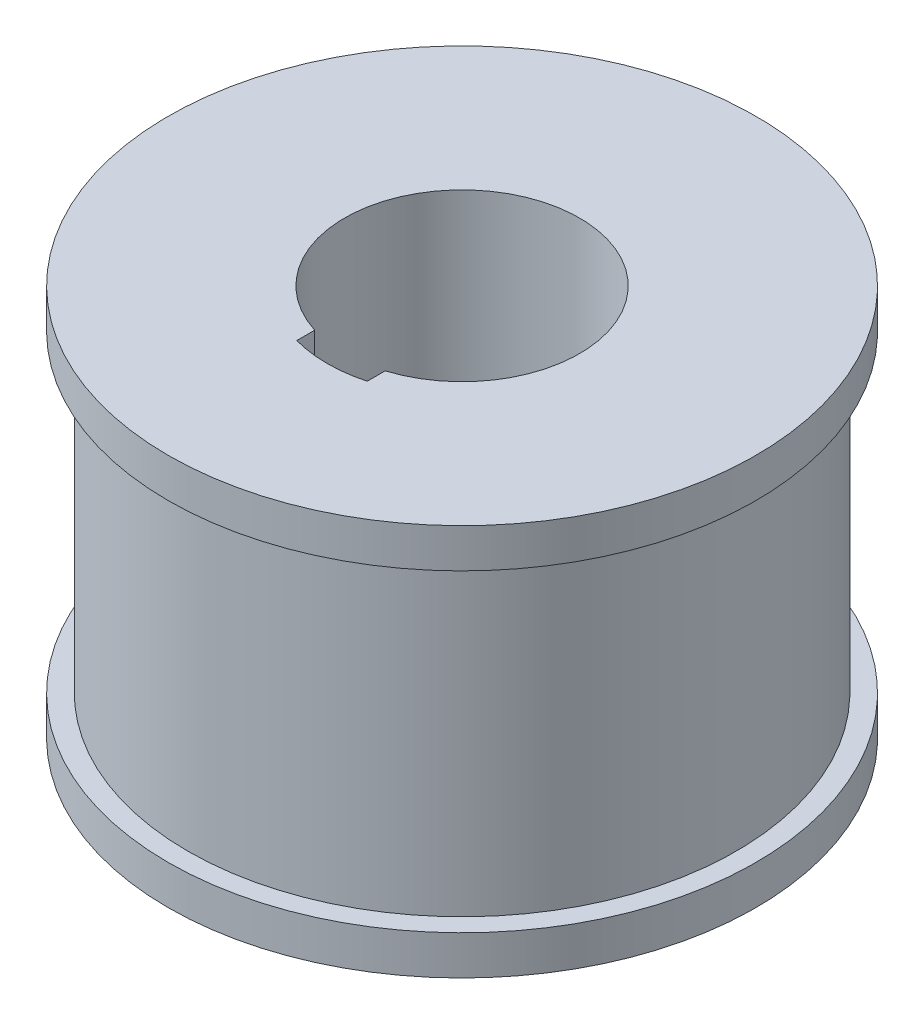
ISO-10303-21;
HEADER;
FILE_DESCRIPTION(('STEP AP214'),'2;1');
FILE_NAME('part.step','',(''),(''),'','','');
FILE_SCHEMA(('AUTOMOTIVE_DESIGN { 1 0 10303 214 1 1 1 1 }'));
ENDSEC;
DATA;
#1=APPLICATION_CONTEXT('core data for automotive mechanical design processes');
#2=APPLICATION_PROTOCOL_DEFINITION('international standard','automotive_design',2000,#1);
#3=PRODUCT_CONTEXT('',#1,'mechanical');
#4=PRODUCT('Part','Part','',(#3));
#5=PRODUCT_RELATED_PRODUCT_CATEGORY('part','',(#4));
#6=PRODUCT_DEFINITION_FORMATION('','',#4);
#7=PRODUCT_DEFINITION_CONTEXT('part definition',#1,'design');
#8=PRODUCT_DEFINITION('design','',#6,#7);
#9=PRODUCT_DEFINITION_SHAPE('','',#8);
#10=(LENGTH_UNIT() NAMED_UNIT(*) SI_UNIT(.MILLI.,.METRE.));
#11=(NAMED_UNIT(*) PLANE_ANGLE_UNIT() SI_UNIT($,.RADIAN.));
#12=(NAMED_UNIT(*) SI_UNIT($,.STERADIAN.) SOLID_ANGLE_UNIT());
#13=UNCERTAINTY_MEASURE_WITH_UNIT(LENGTH_MEASURE(1.E-05),#10,'distance_accuracy_value','');
#14=(GEOMETRIC_REPRESENTATION_CONTEXT(3) GLOBAL_UNCERTAINTY_ASSIGNED_CONTEXT((#13)) GLOBAL_UNIT_ASSIGNED_CONTEXT((#10,
#11,#12)) REPRESENTATION_CONTEXT('',''));
#15=CARTESIAN_POINT('',(0.,0.,0.));
#16=DIRECTION('',(0.,0.,1.));
#17=DIRECTION('',(1.,0.,0.));
#18=AXIS2_PLACEMENT_3D('',#15,#16,#17);
#19=CARTESIAN_POINT('',(0.,40.,0.));
#20=DIRECTION('',(0.,-1.,0.));
#21=DIRECTION('',(0.,0.,-1.));
#22=AXIS2_PLACEMENT_3D('',#19,#20,#21);
#23=CYLINDRICAL_SURFACE('',#22,70.);
#24=CARTESIAN_POINT('',(0.,40.,0.));
#25=DIRECTION('',(0.,1.,0.));
#26=DIRECTION('',(0.,0.,1.));
#27=AXIS2_PLACEMENT_3D('',#24,#25,#26);
#28=CIRCLE('',#27,70.);
#29=CARTESIAN_POINT('',(0.,40.,70.));
#30=VERTEX_POINT('',#29);
#31=EDGE_CURVE('E50',#30,#30,#28,.T.);
#32=ORIENTED_EDGE('',*,*,#31,.F.);
#33=EDGE_LOOP('',(#32));
#34=FACE_BOUND('',#33,.T.);
#35=CARTESIAN_POINT('',(0.,-40.,0.));
#36=DIRECTION('',(0.,1.,0.));
#37=DIRECTION('',(0.,0.,1.));
#38=AXIS2_PLACEMENT_3D('',#35,#36,#37);
#39=CIRCLE('',#38,70.);
#40=CARTESIAN_POINT('',(0.,-40.,70.));
#41=VERTEX_POINT('',#40);
#42=EDGE_CURVE('E118',#41,#41,#39,.T.);
#43=ORIENTED_EDGE('',*,*,#42,.T.);
#44=EDGE_LOOP('',(#43));
#45=FACE_BOUND('',#44,.T.);
#46=ADVANCED_FACE('F43',(#34,#45),#23,.T.);
#47=CARTESIAN_POINT('',(0.,40.,0.));
#48=DIRECTION('',(0.,-1.,0.));
#49=DIRECTION('',(0.,0.,-1.));
#50=AXIS2_PLACEMENT_3D('',#47,#48,#49);
#51=CYLINDRICAL_SURFACE('',#50,30.);
#52=DIRECTION('',(0.,-1.,0.));
#53=VECTOR('',#52,1.);
#54=CARTESIAN_POINT('',(8.99999999999999,40.,28.6181760425084));
#55=LINE('',#54,#53);
#56=CARTESIAN_POINT('',(9.,50.,28.6181760425084));
#57=VERTEX_POINT('',#56);
#58=CARTESIAN_POINT('',(9.,-50.,28.6181760425084));
#59=VERTEX_POINT('',#58);
#60=EDGE_CURVE('E109',#57,#59,#55,.T.);
#61=ORIENTED_EDGE('',*,*,#60,.F.);
#62=CARTESIAN_POINT('',(0.,50.,0.));
#63=DIRECTION('',(0.,1.,0.));
#64=DIRECTION('',(0.,0.,1.));
#65=AXIS2_PLACEMENT_3D('',#62,#63,#64);
#66=CIRCLE('',#65,30.);
#67=CARTESIAN_POINT('',(-9.,50.,28.6181760425084));
#68=VERTEX_POINT('',#67);
#69=EDGE_CURVE('E121',#57,#68,#66,.T.);
#70=ORIENTED_EDGE('',*,*,#69,.T.);
#71=DIRECTION('',(0.,-1.,0.));
#72=VECTOR('',#71,1.);
#73=CARTESIAN_POINT('',(-8.99999999999999,40.,28.6181760425084));
#74=LINE('',#73,#72);
#75=CARTESIAN_POINT('',(-9.,-50.,28.6181760425084));
#76=VERTEX_POINT('',#75);
#77=EDGE_CURVE('E94',#76,#68,#74,.F.);
#78=ORIENTED_EDGE('',*,*,#77,.F.);
#79=CARTESIAN_POINT('',(0.,-50.,0.));
#80=DIRECTION('',(0.,1.,0.));
#81=DIRECTION('',(0.,0.,1.));
#82=AXIS2_PLACEMENT_3D('',#79,#80,#81);
#83=CIRCLE('',#82,30.);
#84=EDGE_CURVE('E111',#59,#76,#83,.T.);
#85=ORIENTED_EDGE('',*,*,#84,.F.);
#86=EDGE_LOOP('',(#61,#70,#78,#85));
#87=FACE_BOUND('',#86,.T.);
#88=ADVANCED_FACE('F157',(#87),#51,.F.);
#89=CARTESIAN_POINT('',(0.,50.,0.));
#90=DIRECTION('',(0.,1.,0.));
#91=DIRECTION('',(0.,0.,1.));
#92=AXIS2_PLACEMENT_3D('',#89,#90,#91);
#93=PLANE('',#92);
#94=DIRECTION('',(0.,0.,1.));
#95=VECTOR('',#94,1.);
#96=CARTESIAN_POINT('',(9.,50.,33.2018071797304));
#97=LINE('',#96,#95);
#98=CARTESIAN_POINT('',(9.,50.,33.2018071797304));
#99=VERTEX_POINT('',#98);
#100=EDGE_CURVE('E65',#57,#99,#97,.T.);
#101=ORIENTED_EDGE('',*,*,#100,.T.);
#102=CARTESIAN_POINT('',(0.,50.,0.));
#103=DIRECTION('',(0.,-1.,0.));
#104=DIRECTION('',(0.,0.,-1.));
#105=AXIS2_PLACEMENT_3D('',#102,#103,#104);
#106=CIRCLE('',#105,34.4);
#107=CARTESIAN_POINT('',(-9.,50.,33.2018071797304));
#108=VERTEX_POINT('',#107);
#109=EDGE_CURVE('E85',#99,#108,#106,.T.);
#110=ORIENTED_EDGE('',*,*,#109,.T.);
#111=DIRECTION('',(0.,0.,-1.));
#112=VECTOR('',#111,1.);
#113=CARTESIAN_POINT('',(-9.,50.,33.2018071797304));
#114=LINE('',#113,#112);
#115=EDGE_CURVE('E91',#108,#68,#114,.T.);
#116=ORIENTED_EDGE('',*,*,#115,.T.);
#117=ORIENTED_EDGE('',*,*,#69,.F.);
#118=EDGE_LOOP('',(#101,#110,#116,#117));
#119=FACE_BOUND('',#118,.T.);
#120=CARTESIAN_POINT('',(0.,50.,0.));
#121=DIRECTION('',(0.,1.,0.));
#122=DIRECTION('',(0.,0.,1.));
#123=AXIS2_PLACEMENT_3D('',#120,#121,#122);
#124=CIRCLE('',#123,75.);
#125=CARTESIAN_POINT('',(0.,50.,75.));
#126=VERTEX_POINT('',#125);
#127=EDGE_CURVE('E124',#126,#126,#124,.T.);
#128=ORIENTED_EDGE('',*,*,#127,.T.);
#129=EDGE_LOOP('',(#128));
#130=FACE_BOUND('',#129,.T.);
#131=ADVANCED_FACE('F99',(#119,#130),#93,.T.);
#132=CARTESIAN_POINT('',(0.,40.,0.));
#133=DIRECTION('',(0.,1.,0.));
#134=DIRECTION('',(0.,0.,1.));
#135=AXIS2_PLACEMENT_3D('',#132,#133,#134);
#136=PLANE('',#135);
#137=ORIENTED_EDGE('',*,*,#31,.T.);
#138=EDGE_LOOP('',(#137));
#139=FACE_BOUND('',#138,.T.);
#140=CARTESIAN_POINT('',(0.,40.,0.));
#141=DIRECTION('',(0.,1.,0.));
#142=DIRECTION('',(0.,0.,1.));
#143=AXIS2_PLACEMENT_3D('',#140,#141,#142);
#144=CIRCLE('',#143,75.);
#145=CARTESIAN_POINT('',(0.,40.,75.));
#146=VERTEX_POINT('',#145);
#147=EDGE_CURVE('E123',#146,#146,#144,.T.);
#148=ORIENTED_EDGE('',*,*,#147,.F.);
#149=EDGE_LOOP('',(#148));
#150=FACE_BOUND('',#149,.T.);
#151=ADVANCED_FACE('F152',(#139,#150),#136,.F.);
#152=CARTESIAN_POINT('',(0.,50.,0.));
#153=DIRECTION('',(0.,-1.,0.));
#154=DIRECTION('',(0.,0.,-1.));
#155=AXIS2_PLACEMENT_3D('',#152,#153,#154);
#156=CYLINDRICAL_SURFACE('',#155,75.);
#157=ORIENTED_EDGE('',*,*,#127,.F.);
#158=EDGE_LOOP('',(#157));
#159=FACE_BOUND('',#158,.T.);
#160=ORIENTED_EDGE('',*,*,#147,.T.);
#161=EDGE_LOOP('',(#160));
#162=FACE_BOUND('',#161,.T.);
#163=ADVANCED_FACE('F143',(#159,#162),#156,.T.);
#164=CARTESIAN_POINT('',(0.,-50.,0.));
#165=DIRECTION('',(0.,1.,0.));
#166=DIRECTION('',(0.,0.,1.));
#167=AXIS2_PLACEMENT_3D('',#164,#165,#166);
#168=CYLINDRICAL_SURFACE('',#167,75.);
#169=CARTESIAN_POINT('',(0.,-50.,0.));
#170=DIRECTION('',(0.,1.,0.));
#171=DIRECTION('',(0.,0.,1.));
#172=AXIS2_PLACEMENT_3D('',#169,#170,#171);
#173=CIRCLE('',#172,75.);
#174=CARTESIAN_POINT('',(0.,-50.,75.));
#175=VERTEX_POINT('',#174);
#176=EDGE_CURVE('E115',#175,#175,#173,.T.);
#177=ORIENTED_EDGE('',*,*,#176,.T.);
#178=EDGE_LOOP('',(#177));
#179=FACE_BOUND('',#178,.T.);
#180=CARTESIAN_POINT('',(0.,-40.,0.));
#181=DIRECTION('',(0.,1.,0.));
#182=DIRECTION('',(0.,0.,1.));
#183=AXIS2_PLACEMENT_3D('',#180,#181,#182);
#184=CIRCLE('',#183,75.);
#185=CARTESIAN_POINT('',(0.,-40.,75.));
#186=VERTEX_POINT('',#185);
#187=EDGE_CURVE('E114',#186,#186,#184,.T.);
#188=ORIENTED_EDGE('',*,*,#187,.F.);
#189=EDGE_LOOP('',(#188));
#190=FACE_BOUND('',#189,.T.);
#191=ADVANCED_FACE('F141',(#179,#190),#168,.T.);
#192=CARTESIAN_POINT('',(0.,-50.,0.));
#193=DIRECTION('',(0.,-1.,0.));
#194=DIRECTION('',(0.,0.,1.));
#195=AXIS2_PLACEMENT_3D('',#192,#193,#194);
#196=PLANE('',#195);
#197=DIRECTION('',(0.,0.,1.));
#198=VECTOR('',#197,1.);
#199=CARTESIAN_POINT('',(8.99999999999999,-50.,0.));
#200=LINE('',#199,#198);
#201=CARTESIAN_POINT('',(9.,-50.,33.2018071797304));
#202=VERTEX_POINT('',#201);
#203=EDGE_CURVE('E11',#59,#202,#200,.T.);
#204=ORIENTED_EDGE('',*,*,#203,.F.);
#205=ORIENTED_EDGE('',*,*,#84,.T.);
#206=DIRECTION('',(0.,0.,-1.));
#207=VECTOR('',#206,1.);
#208=CARTESIAN_POINT('',(-9.,-50.,33.2018071797304));
#209=LINE('',#208,#207);
#210=CARTESIAN_POINT('',(-9.,-50.,33.2018071797304));
#211=VERTEX_POINT('',#210);
#212=EDGE_CURVE('E101',#211,#76,#209,.T.);
#213=ORIENTED_EDGE('',*,*,#212,.F.);
#214=CARTESIAN_POINT('',(0.,-50.,0.));
#215=DIRECTION('',(0.,-1.,0.));
#216=DIRECTION('',(0.,0.,-1.));
#217=AXIS2_PLACEMENT_3D('',#214,#215,#216);
#218=CIRCLE('',#217,34.4);
#219=EDGE_CURVE('E57',#202,#211,#218,.T.);
#220=ORIENTED_EDGE('',*,*,#219,.F.);
#221=EDGE_LOOP('',(#204,#205,#213,#220));
#222=FACE_BOUND('',#221,.T.);
#223=ORIENTED_EDGE('',*,*,#176,.F.);
#224=EDGE_LOOP('',(#223));
#225=FACE_BOUND('',#224,.T.);
#226=ADVANCED_FACE('F137',(#222,#225),#196,.T.);
#227=CARTESIAN_POINT('',(0.,-40.,0.));
#228=DIRECTION('',(0.,-1.,0.));
#229=DIRECTION('',(0.,0.,1.));
#230=AXIS2_PLACEMENT_3D('',#227,#228,#229);
#231=PLANE('',#230);
#232=ORIENTED_EDGE('',*,*,#42,.F.);
#233=EDGE_LOOP('',(#232));
#234=FACE_BOUND('',#233,.T.);
#235=ORIENTED_EDGE('',*,*,#187,.T.);
#236=EDGE_LOOP('',(#235));
#237=FACE_BOUND('',#236,.T.);
#238=ADVANCED_FACE('F134',(#234,#237),#231,.F.);
#239=CARTESIAN_POINT('',(0.,50.,0.));
#240=DIRECTION('',(0.,-1.,0.));
#241=DIRECTION('',(0.,0.,-1.));
#242=AXIS2_PLACEMENT_3D('',#239,#240,#241);
#243=CYLINDRICAL_SURFACE('',#242,34.4);
#244=ORIENTED_EDGE('',*,*,#219,.T.);
#245=DIRECTION('',(0.,-1.,0.));
#246=VECTOR('',#245,1.);
#247=CARTESIAN_POINT('',(-9.,50.,33.2018071797304));
#248=LINE('',#247,#246);
#249=EDGE_CURVE('E81',#108,#211,#248,.T.);
#250=ORIENTED_EDGE('',*,*,#249,.F.);
#251=ORIENTED_EDGE('',*,*,#109,.F.);
#252=DIRECTION('',(0.,-1.,0.));
#253=VECTOR('',#252,1.);
#254=CARTESIAN_POINT('',(9.,50.,33.2018071797304));
#255=LINE('',#254,#253);
#256=EDGE_CURVE('E88',#99,#202,#255,.T.);
#257=ORIENTED_EDGE('',*,*,#256,.T.);
#258=EDGE_LOOP('',(#244,#250,#251,#257));
#259=FACE_BOUND('',#258,.T.);
#260=ADVANCED_FACE('F83',(#259),#243,.F.);
#261=CARTESIAN_POINT('',(9.,50.,33.2018071797304));
#262=DIRECTION('',(1.,0.,0.));
#263=DIRECTION('',(0.,0.,-1.));
#264=AXIS2_PLACEMENT_3D('',#261,#262,#263);
#265=PLANE('',#264);
#266=ORIENTED_EDGE('',*,*,#60,.T.);
#267=ORIENTED_EDGE('',*,*,#203,.T.);
#268=ORIENTED_EDGE('',*,*,#256,.F.);
#269=ORIENTED_EDGE('',*,*,#100,.F.);
#270=EDGE_LOOP('',(#266,#267,#268,#269));
#271=FACE_BOUND('',#270,.T.);
#272=ADVANCED_FACE('F193',(#271),#265,.F.);
#273=CARTESIAN_POINT('',(-9.,50.,33.2018071797304));
#274=DIRECTION('',(-1.,0.,0.));
#275=DIRECTION('',(0.,0.,1.));
#276=AXIS2_PLACEMENT_3D('',#273,#274,#275);
#277=PLANE('',#276);
#278=ORIENTED_EDGE('',*,*,#77,.T.);
#279=ORIENTED_EDGE('',*,*,#115,.F.);
#280=ORIENTED_EDGE('',*,*,#249,.T.);
#281=ORIENTED_EDGE('',*,*,#212,.T.);
#282=EDGE_LOOP('',(#278,#279,#280,#281));
#283=FACE_BOUND('',#282,.T.);
#284=ADVANCED_FACE('F92',(#283),#277,.F.);
#285=CLOSED_SHELL('',(#46,#88,#131,#151,#163,#191,#226,#238,#260,#272,#284));
#286=MANIFOLD_SOLID_BREP('B2',#285);
#287=ADVANCED_BREP_SHAPE_REPRESENTATION('',(#18,#286),#14);
#288=SHAPE_DEFINITION_REPRESENTATION(#9,#287);
ENDSEC;
END-ISO-10303-21;
